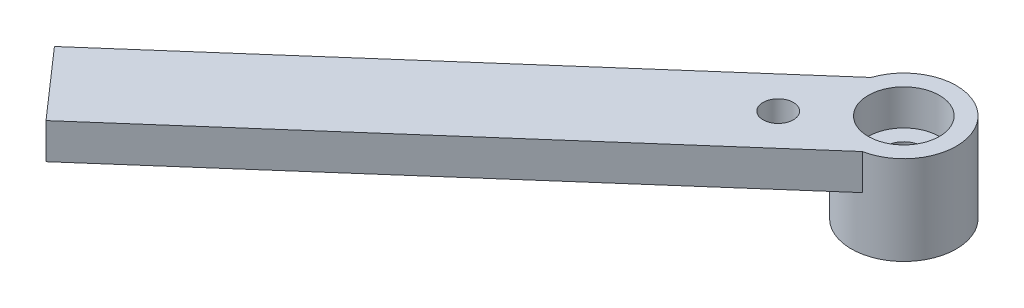
ISO-10303-21;
HEADER;
FILE_DESCRIPTION(('STEP AP214'),'2;1');
FILE_NAME('part.step','',(''),(''),'','','');
FILE_SCHEMA(('AUTOMOTIVE_DESIGN { 1 0 10303 214 1 1 1 1 }'));
ENDSEC;
DATA;
#1=APPLICATION_CONTEXT('core data for automotive mechanical design processes');
#2=APPLICATION_PROTOCOL_DEFINITION('international standard','automotive_design',2000,#1);
#3=PRODUCT_CONTEXT('',#1,'mechanical');
#4=PRODUCT('Part','Part','',(#3));
#5=PRODUCT_RELATED_PRODUCT_CATEGORY('part','',(#4));
#6=PRODUCT_DEFINITION_FORMATION('','',#4);
#7=PRODUCT_DEFINITION_CONTEXT('part definition',#1,'design');
#8=PRODUCT_DEFINITION('design','',#6,#7);
#9=PRODUCT_DEFINITION_SHAPE('','',#8);
#10=(LENGTH_UNIT() NAMED_UNIT(*) SI_UNIT(.MILLI.,.METRE.));
#11=(NAMED_UNIT(*) PLANE_ANGLE_UNIT() SI_UNIT($,.RADIAN.));
#12=(NAMED_UNIT(*) SI_UNIT($,.STERADIAN.) SOLID_ANGLE_UNIT());
#13=UNCERTAINTY_MEASURE_WITH_UNIT(LENGTH_MEASURE(1.E-05),#10,'distance_accuracy_value','');
#14=(GEOMETRIC_REPRESENTATION_CONTEXT(3) GLOBAL_UNCERTAINTY_ASSIGNED_CONTEXT((#13)) GLOBAL_UNIT_ASSIGNED_CONTEXT((#10,
#11,#12)) REPRESENTATION_CONTEXT('',''));
#15=CARTESIAN_POINT('',(0.,0.,0.));
#16=DIRECTION('',(0.,0.,1.));
#17=DIRECTION('',(1.,0.,0.));
#18=AXIS2_PLACEMENT_3D('',#15,#16,#17);
#19=CARTESIAN_POINT('',(-54.3717723606616,16.1569540318952,401.37268355169));
#20=DIRECTION('',(0.,1.,0.));
#21=DIRECTION('',(-1.,0.,0.));
#22=AXIS2_PLACEMENT_3D('',#19,#20,#21);
#23=PLANE('',#22);
#24=CARTESIAN_POINT('',(-61.8908851846646,16.1569540318952,407.965326598293));
#25=DIRECTION('',(0.,-1.,0.));
#26=DIRECTION('',(1.,0.,0.));
#27=AXIS2_PLACEMENT_3D('',#24,#25,#26);
#28=CIRCLE('',#27,1.7);
#29=CARTESIAN_POINT('',(-60.1908851846646,16.1569540318952,407.965326598293));
#30=VERTEX_POINT('',#29);
#31=EDGE_CURVE('E142',#30,#30,#28,.T.);
#32=ORIENTED_EDGE('',*,*,#31,.F.);
#33=EDGE_LOOP('',(#32));
#34=FACE_BOUND('',#33,.T.);
#35=CARTESIAN_POINT('',(-54.3717723606616,16.1569540318952,401.37268355169));
#36=DIRECTION('',(0.,-1.,0.));
#37=DIRECTION('',(1.,0.,0.));
#38=AXIS2_PLACEMENT_3D('',#35,#36,#37);
#39=CIRCLE('',#38,5.90000000000027);
#40=CARTESIAN_POINT('',(-53.2248893633559,16.1569540318952,407.160140626304));
#41=VERTEX_POINT('',#40);
#42=CARTESIAN_POINT('',(-59.95960820894,16.1569540318952,399.478985969525));
#43=VERTEX_POINT('',#42);
#44=EDGE_CURVE('E87',#41,#43,#39,.T.);
#45=ORIENTED_EDGE('',*,*,#44,.F.);
#46=DIRECTION('',(0.751911282400305,0.,-0.659264304660224));
#47=VECTOR('',#46,1.);
#48=CARTESIAN_POINT('',(-94.5800098953725,16.1569540318953,443.419677382616));
#49=LINE('',#48,#47);
#50=CARTESIAN_POINT('',(-102.099122719376,16.1569540318953,450.012320429219));
#51=VERTEX_POINT('',#50);
#52=EDGE_CURVE('E93',#51,#41,#49,.T.);
#53=ORIENTED_EDGE('',*,*,#52,.F.);
#54=DIRECTION('',(0.659264304660227,0.,0.751911282400303));
#55=VECTOR('',#54,1.);
#56=CARTESIAN_POINT('',(-108.83384156496,16.1569540318953,442.33116577244));
#57=LINE('',#56,#55);
#58=CARTESIAN_POINT('',(-108.83384156496,16.1569540318953,442.33116577244));
#59=VERTEX_POINT('',#58);
#60=EDGE_CURVE('E100',#59,#51,#57,.T.);
#61=ORIENTED_EDGE('',*,*,#60,.F.);
#62=DIRECTION('',(-0.751911282400303,0.,0.659264304660226));
#63=VECTOR('',#62,1.);
#64=CARTESIAN_POINT('',(-59.95960820894,16.1569540318952,399.478985969525));
#65=LINE('',#64,#63);
#66=EDGE_CURVE('E95',#43,#59,#65,.T.);
#67=ORIENTED_EDGE('',*,*,#66,.F.);
#68=EDGE_LOOP('',(#45,#53,#61,#67));
#69=FACE_BOUND('',#68,.T.);
#70=ADVANCED_FACE('F47',(#34,#69),#23,.F.);
#71=CARTESIAN_POINT('',(-54.3717723606616,16.1569540318952,401.37268355169));
#72=DIRECTION('',(0.,1.,0.));
#73=DIRECTION('',(-1.,0.,0.));
#74=AXIS2_PLACEMENT_3D('',#71,#72,#73);
#75=CYLINDRICAL_SURFACE('',#74,5.90000000000025);
#76=CARTESIAN_POINT('',(-54.3717723606616,20.1569540318952,401.37268355169));
#77=DIRECTION('',(0.,1.,0.));
#78=DIRECTION('',(-1.,0.,0.));
#79=AXIS2_PLACEMENT_3D('',#76,#77,#78);
#80=CIRCLE('',#79,5.90000000000025);
#81=CARTESIAN_POINT('',(-53.2248893633559,20.1569540318952,407.160140626304));
#82=VERTEX_POINT('',#81);
#83=CARTESIAN_POINT('',(-59.95960820894,20.1569540318952,399.478985969525));
#84=VERTEX_POINT('',#83);
#85=EDGE_CURVE('E104',#82,#84,#80,.T.);
#86=ORIENTED_EDGE('',*,*,#85,.F.);
#87=DIRECTION('',(0.,1.,0.));
#88=VECTOR('',#87,1.);
#89=CARTESIAN_POINT('',(-53.2248893633559,16.1569540318952,407.160140626304));
#90=LINE('',#89,#88);
#91=EDGE_CURVE('E12',#41,#82,#90,.T.);
#92=ORIENTED_EDGE('',*,*,#91,.F.);
#93=ORIENTED_EDGE('',*,*,#44,.T.);
#94=DIRECTION('',(0.,1.,0.));
#95=VECTOR('',#94,1.);
#96=CARTESIAN_POINT('',(-59.95960820894,16.1569540318952,399.478985969525));
#97=LINE('',#96,#95);
#98=EDGE_CURVE('E51',#43,#84,#97,.T.);
#99=ORIENTED_EDGE('',*,*,#98,.T.);
#100=EDGE_LOOP('',(#86,#92,#93,#99));
#101=FACE_BOUND('',#100,.T.);
#102=CARTESIAN_POINT('',(-54.3717723606616,10.1569540318952,401.37268355169));
#103=DIRECTION('',(0.,-1.,0.));
#104=DIRECTION('',(1.,0.,0.));
#105=AXIS2_PLACEMENT_3D('',#102,#103,#104);
#106=CIRCLE('',#105,5.90000000000027);
#107=CARTESIAN_POINT('',(-48.4717723606613,10.1569540318952,401.37268355169));
#108=VERTEX_POINT('',#107);
#109=EDGE_CURVE('E96',#108,#108,#106,.T.);
#110=ORIENTED_EDGE('',*,*,#109,.F.);
#111=EDGE_LOOP('',(#110));
#112=FACE_BOUND('',#111,.T.);
#113=ADVANCED_FACE('F49',(#101,#112),#75,.T.);
#114=CARTESIAN_POINT('',(-94.5800098953725,16.1569540318953,443.419677382616));
#115=DIRECTION('',(0.659264304660226,0.,0.751911282400303));
#116=DIRECTION('',(0.751911282400303,0.,-0.659264304660226));
#117=AXIS2_PLACEMENT_3D('',#114,#115,#116);
#118=PLANE('',#117);
#119=DIRECTION('',(0.751911282400303,0.,-0.659264304660226));
#120=VECTOR('',#119,1.);
#121=CARTESIAN_POINT('',(-94.5800098953725,20.1569540318953,443.419677382616));
#122=LINE('',#121,#120);
#123=CARTESIAN_POINT('',(-102.099122719376,20.1569540318953,450.012320429219));
#124=VERTEX_POINT('',#123);
#125=EDGE_CURVE('E80',#124,#82,#122,.T.);
#126=ORIENTED_EDGE('',*,*,#125,.F.);
#127=DIRECTION('',(0.,1.,0.));
#128=VECTOR('',#127,1.);
#129=CARTESIAN_POINT('',(-102.099122719376,16.1569540318953,450.012320429219));
#130=LINE('',#129,#128);
#131=EDGE_CURVE('E57',#51,#124,#130,.T.);
#132=ORIENTED_EDGE('',*,*,#131,.F.);
#133=ORIENTED_EDGE('',*,*,#52,.T.);
#134=ORIENTED_EDGE('',*,*,#91,.T.);
#135=EDGE_LOOP('',(#126,#132,#133,#134));
#136=FACE_BOUND('',#135,.T.);
#137=ADVANCED_FACE('F99',(#136),#118,.T.);
#138=CARTESIAN_POINT('',(-108.83384156496,16.1569540318953,442.33116577244));
#139=DIRECTION('',(-0.751911282400303,0.,0.659264304660227));
#140=DIRECTION('',(0.659264304660227,0.,0.751911282400303));
#141=AXIS2_PLACEMENT_3D('',#138,#139,#140);
#142=PLANE('',#141);
#143=DIRECTION('',(0.659264304660227,0.,0.751911282400303));
#144=VECTOR('',#143,1.);
#145=CARTESIAN_POINT('',(-108.83384156496,20.1569540318953,442.33116577244));
#146=LINE('',#145,#144);
#147=CARTESIAN_POINT('',(-108.83384156496,20.1569540318953,442.33116577244));
#148=VERTEX_POINT('',#147);
#149=EDGE_CURVE('E113',#148,#124,#146,.T.);
#150=ORIENTED_EDGE('',*,*,#149,.F.);
#151=DIRECTION('',(0.,1.,0.));
#152=VECTOR('',#151,1.);
#153=CARTESIAN_POINT('',(-108.83384156496,16.1569540318953,442.33116577244));
#154=LINE('',#153,#152);
#155=EDGE_CURVE('E119',#59,#148,#154,.T.);
#156=ORIENTED_EDGE('',*,*,#155,.F.);
#157=ORIENTED_EDGE('',*,*,#60,.T.);
#158=ORIENTED_EDGE('',*,*,#131,.T.);
#159=EDGE_LOOP('',(#150,#156,#157,#158));
#160=FACE_BOUND('',#159,.T.);
#161=ADVANCED_FACE('F124',(#160),#142,.T.);
#162=CARTESIAN_POINT('',(-101.314728740957,16.1569540318953,435.738522725838));
#163=DIRECTION('',(-0.659264304660224,0.,-0.751911282400305));
#164=DIRECTION('',(-0.751911282400305,0.,0.659264304660224));
#165=AXIS2_PLACEMENT_3D('',#162,#163,#164);
#166=PLANE('',#165);
#167=DIRECTION('',(-0.751911282400305,0.,0.659264304660224));
#168=VECTOR('',#167,1.);
#169=CARTESIAN_POINT('',(-101.314728740957,20.1569540318953,435.738522725838));
#170=LINE('',#169,#168);
#171=EDGE_CURVE('E107',#84,#148,#170,.T.);
#172=ORIENTED_EDGE('',*,*,#171,.F.);
#173=ORIENTED_EDGE('',*,*,#98,.F.);
#174=ORIENTED_EDGE('',*,*,#66,.T.);
#175=ORIENTED_EDGE('',*,*,#155,.T.);
#176=EDGE_LOOP('',(#172,#173,#174,#175));
#177=FACE_BOUND('',#176,.T.);
#178=ADVANCED_FACE('F122',(#177),#166,.T.);
#179=CARTESIAN_POINT('',(-54.3717723606616,20.1569540318952,401.37268355169));
#180=DIRECTION('',(0.,1.,0.));
#181=DIRECTION('',(-1.,0.,0.));
#182=AXIS2_PLACEMENT_3D('',#179,#180,#181);
#183=PLANE('',#182);
#184=CARTESIAN_POINT('',(-61.8908851846646,20.1569540318952,407.965326598293));
#185=DIRECTION('',(0.,1.,0.));
#186=DIRECTION('',(-1.,0.,0.));
#187=AXIS2_PLACEMENT_3D('',#184,#185,#186);
#188=CIRCLE('',#187,1.7);
#189=CARTESIAN_POINT('',(-63.5908851846646,20.1569540318952,407.965326598293));
#190=VERTEX_POINT('',#189);
#191=EDGE_CURVE('E137',#190,#190,#188,.F.);
#192=ORIENTED_EDGE('',*,*,#191,.T.);
#193=EDGE_LOOP('',(#192));
#194=FACE_BOUND('',#193,.T.);
#195=CARTESIAN_POINT('',(-54.3717723606616,20.1569540318952,401.37268355169));
#196=DIRECTION('',(0.,1.,0.));
#197=DIRECTION('',(-1.,0.,0.));
#198=AXIS2_PLACEMENT_3D('',#195,#196,#197);
#199=CIRCLE('',#198,4.00000000000001);
#200=CARTESIAN_POINT('',(-58.3717723606616,20.1569540318952,401.37268355169));
#201=VERTEX_POINT('',#200);
#202=EDGE_CURVE('E127',#201,#201,#199,.T.);
#203=ORIENTED_EDGE('',*,*,#202,.F.);
#204=EDGE_LOOP('',(#203));
#205=FACE_BOUND('',#204,.T.);
#206=ORIENTED_EDGE('',*,*,#85,.T.);
#207=ORIENTED_EDGE('',*,*,#171,.T.);
#208=ORIENTED_EDGE('',*,*,#149,.T.);
#209=ORIENTED_EDGE('',*,*,#125,.T.);
#210=EDGE_LOOP('',(#206,#207,#208,#209));
#211=FACE_BOUND('',#210,.T.);
#212=ADVANCED_FACE('F111',(#194,#205,#211),#183,.T.);
#213=CARTESIAN_POINT('',(-54.3717723606616,16.1569540318952,401.37268355169));
#214=DIRECTION('',(0.,1.,0.));
#215=DIRECTION('',(-1.,0.,0.));
#216=AXIS2_PLACEMENT_3D('',#213,#214,#215);
#217=CYLINDRICAL_SURFACE('',#216,4.00000000000001);
#218=CARTESIAN_POINT('',(-54.3717723606616,16.1569540318952,401.37268355169));
#219=DIRECTION('',(0.,1.,0.));
#220=DIRECTION('',(-1.,0.,0.));
#221=AXIS2_PLACEMENT_3D('',#218,#219,#220);
#222=CIRCLE('',#221,4.00000000000001);
#223=CARTESIAN_POINT('',(-58.3717723606616,16.1569540318952,401.37268355169));
#224=VERTEX_POINT('',#223);
#225=EDGE_CURVE('E108',#224,#224,#222,.T.);
#226=ORIENTED_EDGE('',*,*,#225,.F.);
#227=EDGE_LOOP('',(#226));
#228=FACE_BOUND('',#227,.T.);
#229=ORIENTED_EDGE('',*,*,#202,.T.);
#230=EDGE_LOOP('',(#229));
#231=FACE_BOUND('',#230,.T.);
#232=ADVANCED_FACE('F156',(#228,#231),#217,.F.);
#233=CARTESIAN_POINT('',(-54.3717723606616,16.1569540318952,401.37268355169));
#234=DIRECTION('',(0.,-1.,0.));
#235=DIRECTION('',(1.,0.,0.));
#236=AXIS2_PLACEMENT_3D('',#233,#234,#235);
#237=PLANE('',#236);
#238=CARTESIAN_POINT('',(-54.3717723606616,16.1569540318952,401.37268355169));
#239=DIRECTION('',(0.,-1.,0.));
#240=DIRECTION('',(1.,0.,0.));
#241=AXIS2_PLACEMENT_3D('',#238,#239,#240);
#242=CIRCLE('',#241,2.09999999999999);
#243=CARTESIAN_POINT('',(-52.2717723606616,16.1569540318952,401.37268355169));
#244=VERTEX_POINT('',#243);
#245=EDGE_CURVE('E134',#244,#244,#242,.T.);
#246=ORIENTED_EDGE('',*,*,#245,.T.);
#247=EDGE_LOOP('',(#246));
#248=FACE_BOUND('',#247,.T.);
#249=ORIENTED_EDGE('',*,*,#225,.T.);
#250=EDGE_LOOP('',(#249));
#251=FACE_BOUND('',#250,.T.);
#252=ADVANCED_FACE('F182',(#248,#251),#237,.F.);
#253=CARTESIAN_POINT('',(-54.3717723606616,10.1569540318952,401.37268355169));
#254=DIRECTION('',(0.,-1.,0.));
#255=DIRECTION('',(1.,0.,0.));
#256=AXIS2_PLACEMENT_3D('',#253,#254,#255);
#257=PLANE('',#256);
#258=ORIENTED_EDGE('',*,*,#109,.T.);
#259=EDGE_LOOP('',(#258));
#260=FACE_BOUND('',#259,.T.);
#261=CARTESIAN_POINT('',(-54.3717723606616,10.1569540318952,401.37268355169));
#262=DIRECTION('',(0.,-1.,0.));
#263=DIRECTION('',(1.,0.,0.));
#264=AXIS2_PLACEMENT_3D('',#261,#262,#263);
#265=CIRCLE('',#264,2.09999999999999);
#266=CARTESIAN_POINT('',(-52.2717723606616,10.1569540318952,401.37268355169));
#267=VERTEX_POINT('',#266);
#268=EDGE_CURVE('E97',#267,#267,#265,.T.);
#269=ORIENTED_EDGE('',*,*,#268,.F.);
#270=EDGE_LOOP('',(#269));
#271=FACE_BOUND('',#270,.T.);
#272=ADVANCED_FACE('F189',(#260,#271),#257,.T.);
#273=CARTESIAN_POINT('',(-54.3717723606616,10.1569540318952,401.37268355169));
#274=DIRECTION('',(0.,1.,0.));
#275=DIRECTION('',(-1.,0.,0.));
#276=AXIS2_PLACEMENT_3D('',#273,#274,#275);
#277=CYLINDRICAL_SURFACE('',#276,2.09999999999999);
#278=ORIENTED_EDGE('',*,*,#268,.T.);
#279=EDGE_LOOP('',(#278));
#280=FACE_BOUND('',#279,.T.);
#281=ORIENTED_EDGE('',*,*,#245,.F.);
#282=EDGE_LOOP('',(#281));
#283=FACE_BOUND('',#282,.T.);
#284=ADVANCED_FACE('F196',(#280,#283),#277,.F.);
#285=CARTESIAN_POINT('',(-61.8908851846646,24.9652801439637,407.965326598293));
#286=DIRECTION('',(0.,-1.,0.));
#287=DIRECTION('',(1.,0.,0.));
#288=AXIS2_PLACEMENT_3D('',#285,#286,#287);
#289=CYLINDRICAL_SURFACE('',#288,1.7);
#290=ORIENTED_EDGE('',*,*,#31,.T.);
#291=EDGE_LOOP('',(#290));
#292=FACE_BOUND('',#291,.T.);
#293=ORIENTED_EDGE('',*,*,#191,.F.);
#294=EDGE_LOOP('',(#293));
#295=FACE_BOUND('',#294,.T.);
#296=ADVANCED_FACE('F146',(#292,#295),#289,.F.);
#297=CLOSED_SHELL('',(#70,#113,#137,#161,#178,#212,#232,#252,#272,#284,#296));
#298=MANIFOLD_SOLID_BREP('B2',#297);
#299=ADVANCED_BREP_SHAPE_REPRESENTATION('',(#18,#298),#14);
#300=SHAPE_DEFINITION_REPRESENTATION(#9,#299);
ENDSEC;
END-ISO-10303-21;
